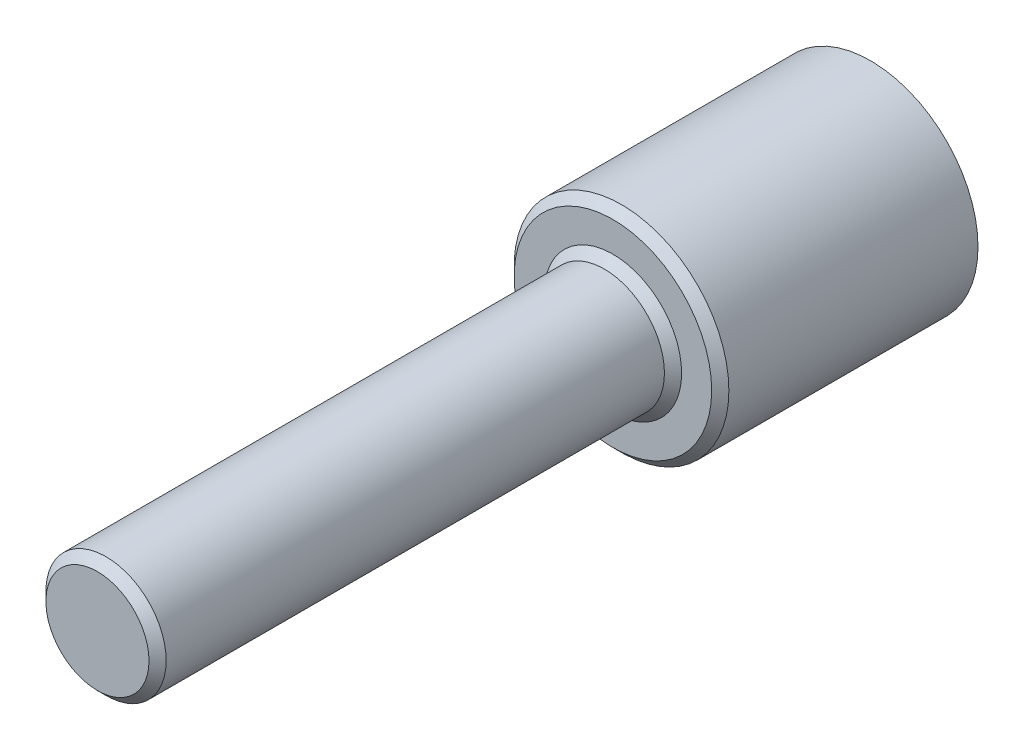
ISO-10303-21;
HEADER;
FILE_DESCRIPTION(('STEP AP214'),'2;1');
FILE_NAME('part.step','',(''),(''),'','','');
FILE_SCHEMA(('AUTOMOTIVE_DESIGN { 1 0 10303 214 1 1 1 1 }'));
ENDSEC;
DATA;
#1=APPLICATION_CONTEXT('core data for automotive mechanical design processes');
#2=APPLICATION_PROTOCOL_DEFINITION('international standard','automotive_design',2000,#1);
#3=PRODUCT_CONTEXT('',#1,'mechanical');
#4=PRODUCT('Part','Part','',(#3));
#5=PRODUCT_RELATED_PRODUCT_CATEGORY('part','',(#4));
#6=PRODUCT_DEFINITION_FORMATION('','',#4);
#7=PRODUCT_DEFINITION_CONTEXT('part definition',#1,'design');
#8=PRODUCT_DEFINITION('design','',#6,#7);
#9=PRODUCT_DEFINITION_SHAPE('','',#8);
#10=(LENGTH_UNIT() NAMED_UNIT(*) SI_UNIT(.MILLI.,.METRE.));
#11=(NAMED_UNIT(*) PLANE_ANGLE_UNIT() SI_UNIT($,.RADIAN.));
#12=(NAMED_UNIT(*) SI_UNIT($,.STERADIAN.) SOLID_ANGLE_UNIT());
#13=UNCERTAINTY_MEASURE_WITH_UNIT(LENGTH_MEASURE(1.E-05),#10,'distance_accuracy_value','');
#14=(GEOMETRIC_REPRESENTATION_CONTEXT(3) GLOBAL_UNCERTAINTY_ASSIGNED_CONTEXT((#13)) GLOBAL_UNIT_ASSIGNED_CONTEXT((#10,
#11,#12)) REPRESENTATION_CONTEXT('',''));
#15=CARTESIAN_POINT('',(0.,0.,0.));
#16=DIRECTION('',(0.,0.,1.));
#17=DIRECTION('',(1.,0.,0.));
#18=AXIS2_PLACEMENT_3D('',#15,#16,#17);
#19=CARTESIAN_POINT('',(0.,0.,28.575));
#20=DIRECTION('',(0.,0.,-1.));
#21=DIRECTION('',(-1.,0.,0.));
#22=AXIS2_PLACEMENT_3D('',#19,#20,#21);
#23=CYLINDRICAL_SURFACE('',#22,3.96875);
#24=CARTESIAN_POINT('',(0.,0.,9.20749999999999));
#25=DIRECTION('',(0.,0.,1.));
#26=DIRECTION('',(1.,0.,0.));
#27=AXIS2_PLACEMENT_3D('',#24,#25,#26);
#28=CIRCLE('',#27,3.96875);
#29=CARTESIAN_POINT('',(3.96875,0.,9.20749999999999));
#30=VERTEX_POINT('',#29);
#31=EDGE_CURVE('E10',#30,#30,#28,.F.);
#32=ORIENTED_EDGE('',*,*,#31,.T.);
#33=EDGE_LOOP('',(#32));
#34=FACE_BOUND('',#33,.T.);
#35=CARTESIAN_POINT('',(0.,0.,0.));
#36=DIRECTION('',(0.,0.,1.));
#37=DIRECTION('',(1.,0.,0.));
#38=AXIS2_PLACEMENT_3D('',#35,#36,#37);
#39=CIRCLE('',#38,3.96875);
#40=CARTESIAN_POINT('',(3.96875,0.,0.));
#41=VERTEX_POINT('',#40);
#42=EDGE_CURVE('E68',#41,#41,#39,.T.);
#43=ORIENTED_EDGE('',*,*,#42,.T.);
#44=EDGE_LOOP('',(#43));
#45=FACE_BOUND('',#44,.T.);
#46=ADVANCED_FACE('F35',(#34,#45),#23,.T.);
#47=CARTESIAN_POINT('',(0.,0.,0.));
#48=DIRECTION('',(0.,0.,1.));
#49=DIRECTION('',(1.,0.,0.));
#50=AXIS2_PLACEMENT_3D('',#47,#48,#49);
#51=PLANE('',#50);
#52=CARTESIAN_POINT('',(0.,0.,0.));
#53=DIRECTION('',(0.,0.,-1.));
#54=DIRECTION('',(-1.,0.,0.));
#55=AXIS2_PLACEMENT_3D('',#52,#53,#54);
#56=CIRCLE('',#55,2.4892);
#57=CARTESIAN_POINT('',(-2.4892,0.,0.));
#58=VERTEX_POINT('',#57);
#59=EDGE_CURVE('E73',#58,#58,#56,.T.);
#60=ORIENTED_EDGE('',*,*,#59,.F.);
#61=EDGE_LOOP('',(#60));
#62=FACE_BOUND('',#61,.T.);
#63=ORIENTED_EDGE('',*,*,#42,.F.);
#64=EDGE_LOOP('',(#63));
#65=FACE_BOUND('',#64,.T.);
#66=ADVANCED_FACE('F89',(#62,#65),#51,.F.);
#67=CARTESIAN_POINT('',(0.,0.,9.525));
#68=DIRECTION('',(0.,0.,1.));
#69=DIRECTION('',(1.,0.,0.));
#70=AXIS2_PLACEMENT_3D('',#67,#68,#69);
#71=CYLINDRICAL_SURFACE('',#70,2.2225);
#72=CARTESIAN_POINT('',(0.,0.,28.2575));
#73=DIRECTION('',(0.,0.,1.));
#74=DIRECTION('',(1.,0.,0.));
#75=AXIS2_PLACEMENT_3D('',#72,#73,#74);
#76=CIRCLE('',#75,2.2225);
#77=CARTESIAN_POINT('',(2.2225,0.,28.2575));
#78=VERTEX_POINT('',#77);
#79=EDGE_CURVE('E55',#78,#78,#76,.F.);
#80=CARTESIAN_POINT('',(0.,0.,9.84250000000001));
#81=DIRECTION('',(0.,0.,1.));
#82=DIRECTION('',(1.,0.,0.));
#83=AXIS2_PLACEMENT_3D('',#80,#81,#82);
#84=CIRCLE('',#83,2.2225);
#85=CARTESIAN_POINT('',(2.2225,0.,9.84250000000001));
#86=VERTEX_POINT('',#85);
#87=EDGE_CURVE('E61',#86,#86,#84,.T.);
#88=CARTESIAN_POINT('',(2.2225,0.,28.2575));
#89=CARTESIAN_POINT('',(2.2225,0.,28.0656770833333));
#90=CARTESIAN_POINT('',(2.2225,0.,27.8738541666667));
#91=CARTESIAN_POINT('',(2.2225,0.,27.4902083333333));
#92=CARTESIAN_POINT('',(2.2225,0.,27.2983854166667));
#93=CARTESIAN_POINT('',(2.2225,0.,26.9147395833333));
#94=CARTESIAN_POINT('',(2.2225,0.,26.7229166666667));
#95=CARTESIAN_POINT('',(2.2225,0.,26.3392708333333));
#96=CARTESIAN_POINT('',(2.2225,0.,26.1474479166667));
#97=CARTESIAN_POINT('',(2.2225,0.,25.7638020833333));
#98=CARTESIAN_POINT('',(2.2225,0.,25.5719791666667));
#99=CARTESIAN_POINT('',(2.2225,0.,25.1883333333333));
#100=CARTESIAN_POINT('',(2.2225,0.,24.9965104166667));
#101=CARTESIAN_POINT('',(2.2225,0.,24.6128645833333));
#102=CARTESIAN_POINT('',(2.2225,0.,24.4210416666667));
#103=CARTESIAN_POINT('',(2.2225,0.,24.0373958333333));
#104=CARTESIAN_POINT('',(2.2225,0.,23.8455729166667));
#105=CARTESIAN_POINT('',(2.2225,0.,23.4619270833333));
#106=CARTESIAN_POINT('',(2.2225,0.,23.2701041666667));
#107=CARTESIAN_POINT('',(2.2225,0.,22.8864583333333));
#108=CARTESIAN_POINT('',(2.2225,0.,22.6946354166667));
#109=CARTESIAN_POINT('',(2.2225,0.,22.3109895833333));
#110=CARTESIAN_POINT('',(2.2225,0.,22.1191666666667));
#111=CARTESIAN_POINT('',(2.2225,0.,21.7355208333333));
#112=CARTESIAN_POINT('',(2.2225,0.,21.5436979166667));
#113=CARTESIAN_POINT('',(2.2225,0.,21.1600520833333));
#114=CARTESIAN_POINT('',(2.2225,0.,20.9682291666667));
#115=CARTESIAN_POINT('',(2.2225,0.,20.5845833333333));
#116=CARTESIAN_POINT('',(2.2225,0.,20.3927604166667));
#117=CARTESIAN_POINT('',(2.2225,0.,20.0091145833333));
#118=CARTESIAN_POINT('',(2.2225,0.,19.8172916666667));
#119=CARTESIAN_POINT('',(2.2225,0.,19.4336458333333));
#120=CARTESIAN_POINT('',(2.2225,0.,19.2418229166667));
#121=CARTESIAN_POINT('',(2.2225,0.,18.8581770833333));
#122=CARTESIAN_POINT('',(2.2225,0.,18.6663541666667));
#123=CARTESIAN_POINT('',(2.2225,0.,18.2827083333333));
#124=CARTESIAN_POINT('',(2.2225,0.,18.0908854166667));
#125=CARTESIAN_POINT('',(2.2225,0.,17.7072395833333));
#126=CARTESIAN_POINT('',(2.2225,0.,17.5154166666667));
#127=CARTESIAN_POINT('',(2.2225,0.,17.1317708333333));
#128=CARTESIAN_POINT('',(2.2225,0.,16.9399479166667));
#129=CARTESIAN_POINT('',(2.2225,0.,16.5563020833333));
#130=CARTESIAN_POINT('',(2.2225,0.,16.3644791666667));
#131=CARTESIAN_POINT('',(2.2225,0.,15.9808333333333));
#132=CARTESIAN_POINT('',(2.2225,0.,15.7890104166667));
#133=CARTESIAN_POINT('',(2.2225,0.,15.4053645833333));
#134=CARTESIAN_POINT('',(2.2225,0.,15.2135416666667));
#135=CARTESIAN_POINT('',(2.2225,0.,14.8298958333333));
#136=CARTESIAN_POINT('',(2.2225,0.,14.6380729166667));
#137=CARTESIAN_POINT('',(2.2225,0.,14.2544270833333));
#138=CARTESIAN_POINT('',(2.2225,0.,14.0626041666667));
#139=CARTESIAN_POINT('',(2.2225,0.,13.6789583333333));
#140=CARTESIAN_POINT('',(2.2225,0.,13.4871354166667));
#141=CARTESIAN_POINT('',(2.2225,0.,13.1034895833333));
#142=CARTESIAN_POINT('',(2.2225,0.,12.9116666666667));
#143=CARTESIAN_POINT('',(2.2225,0.,12.5280208333333));
#144=CARTESIAN_POINT('',(2.2225,0.,12.3361979166667));
#145=CARTESIAN_POINT('',(2.2225,0.,11.9525520833333));
#146=CARTESIAN_POINT('',(2.2225,0.,11.7607291666667));
#147=CARTESIAN_POINT('',(2.2225,0.,11.3770833333333));
#148=CARTESIAN_POINT('',(2.2225,0.,11.1852604166667));
#149=CARTESIAN_POINT('',(2.2225,0.,10.8016145833333));
#150=CARTESIAN_POINT('',(2.2225,0.,10.6097916666667));
#151=CARTESIAN_POINT('',(2.2225,0.,10.2261458333333));
#152=CARTESIAN_POINT('',(2.2225,0.,10.0343229166667));
#153=CARTESIAN_POINT('',(2.2225,0.,9.84250000000001));
#154=B_SPLINE_CURVE_WITH_KNOTS('',3,(#88,#89,#90,#91,#92,#93,#94,#95,#96,#97,#98,#99,#100,#101,
#102,#103,#104,#105,#106,#107,#108,#109,#110,#111,#112,#113,#114,#115,#116,#117,#118,#119,#120,
#121,#122,#123,#124,#125,#126,#127,#128,#129,#130,#131,#132,#133,#134,#135,#136,#137,#138,#139,
#140,#141,#142,#143,#144,#145,#146,#147,#148,#149,#150,#151,#152,#153),.UNSPECIFIED.,.F.,.F.,(4,
2,2,2,2,2,2,2,2,2,2,2,2,2,2,2,2,2,2,2,2,2,2,2,2,2,2,2,2,2,2,2,4),(0.,0.575468749999999,
1.1509375,1.72640625,2.301875,2.87734375,3.4528125,4.02828125,4.60375,5.17921875,5.7546875,
6.33015625,6.905625,7.48109375,8.0565625,8.63203125,9.2075,9.78296875,10.3584375,10.93390625,
11.509375,12.08484375,12.6603125,13.23578125,13.81125,14.38671875,14.9621875,15.53765625,
16.113125,16.68859375,17.2640625,17.83953125,18.415),.UNSPECIFIED.);
#155=EDGE_CURVE('BSEAM92',#78,#86,#154,.T.);
#156=ORIENTED_EDGE('',*,*,#79,.T.);
#157=ORIENTED_EDGE('',*,*,#87,.T.);
#158=ORIENTED_EDGE('',*,*,#155,.T.);
#159=ORIENTED_EDGE('',*,*,#155,.F.);
#160=EDGE_LOOP('',(#156,#158,#157,#159));
#161=FACE_BOUND('',#160,.T.);
#162=ADVANCED_FACE('F92',(#161),#71,.T.);
#163=CARTESIAN_POINT('',(0.,0.,9.525));
#164=DIRECTION('',(0.,0.,1.));
#165=DIRECTION('',(1.,0.,0.));
#166=AXIS2_PLACEMENT_3D('',#163,#164,#165);
#167=PLANE('',#166);
#168=CARTESIAN_POINT('',(0.,0.,9.525));
#169=DIRECTION('',(0.,0.,1.));
#170=DIRECTION('',(1.,0.,0.));
#171=AXIS2_PLACEMENT_3D('',#168,#169,#170);
#172=CIRCLE('',#171,3.65124999999999);
#173=CARTESIAN_POINT('',(3.65124999999999,0.,9.525));
#174=VERTEX_POINT('',#173);
#175=EDGE_CURVE('E43',#174,#174,#172,.T.);
#176=ORIENTED_EDGE('',*,*,#175,.T.);
#177=EDGE_LOOP('',(#176));
#178=FACE_BOUND('',#177,.T.);
#179=CARTESIAN_POINT('',(0.,0.,9.525));
#180=DIRECTION('',(0.,0.,1.));
#181=DIRECTION('',(1.,0.,0.));
#182=AXIS2_PLACEMENT_3D('',#179,#180,#181);
#183=CIRCLE('',#182,2.54);
#184=CARTESIAN_POINT('',(2.54,0.,9.525));
#185=VERTEX_POINT('',#184);
#186=EDGE_CURVE('E49',#185,#185,#183,.F.);
#187=ORIENTED_EDGE('',*,*,#186,.T.);
#188=EDGE_LOOP('',(#187));
#189=FACE_BOUND('',#188,.T.);
#190=ADVANCED_FACE('F120',(#178,#189),#167,.T.);
#191=CARTESIAN_POINT('',(0.,0.,28.575));
#192=DIRECTION('',(0.,0.,1.));
#193=DIRECTION('',(1.,0.,0.));
#194=AXIS2_PLACEMENT_3D('',#191,#192,#193);
#195=PLANE('',#194);
#196=CARTESIAN_POINT('',(0.,0.,28.575));
#197=DIRECTION('',(0.,0.,1.));
#198=DIRECTION('',(1.,0.,0.));
#199=AXIS2_PLACEMENT_3D('',#196,#197,#198);
#200=CIRCLE('',#199,1.90500000000001);
#201=CARTESIAN_POINT('',(1.90500000000001,0.,28.575));
#202=VERTEX_POINT('',#201);
#203=EDGE_CURVE('E64',#202,#202,#200,.T.);
#204=ORIENTED_EDGE('',*,*,#203,.T.);
#205=EDGE_LOOP('',(#204));
#206=FACE_BOUND('',#205,.T.);
#207=ADVANCED_FACE('F85',(#206),#195,.T.);
#208=CARTESIAN_POINT('',(0.,0.,7.62));
#209=DIRECTION('',(0.,0.,-1.));
#210=DIRECTION('',(-1.,0.,0.));
#211=AXIS2_PLACEMENT_3D('',#208,#209,#210);
#212=CYLINDRICAL_SURFACE('',#211,2.4892);
#213=CARTESIAN_POINT('',(0.,0.,7.62));
#214=DIRECTION('',(0.,0.,-1.));
#215=DIRECTION('',(-1.,0.,0.));
#216=AXIS2_PLACEMENT_3D('',#213,#214,#215);
#217=CIRCLE('',#216,2.4892);
#218=CARTESIAN_POINT('',(-2.4892,0.,7.62));
#219=VERTEX_POINT('',#218);
#220=EDGE_CURVE('E72',#219,#219,#217,.T.);
#221=CARTESIAN_POINT('',(-2.4892,0.,7.62));
#222=CARTESIAN_POINT('',(-2.4892,0.,7.540625));
#223=CARTESIAN_POINT('',(-2.4892,0.,7.46125));
#224=CARTESIAN_POINT('',(-2.4892,0.,7.3025));
#225=CARTESIAN_POINT('',(-2.4892,0.,7.223125));
#226=CARTESIAN_POINT('',(-2.4892,0.,7.064375));
#227=CARTESIAN_POINT('',(-2.4892,0.,6.985));
#228=CARTESIAN_POINT('',(-2.4892,0.,6.82625));
#229=CARTESIAN_POINT('',(-2.4892,0.,6.746875));
#230=CARTESIAN_POINT('',(-2.4892,0.,6.588125));
#231=CARTESIAN_POINT('',(-2.4892,0.,6.50875));
#232=CARTESIAN_POINT('',(-2.4892,0.,6.35));
#233=CARTESIAN_POINT('',(-2.4892,0.,6.270625));
#234=CARTESIAN_POINT('',(-2.4892,0.,6.111875));
#235=CARTESIAN_POINT('',(-2.4892,0.,6.0325));
#236=CARTESIAN_POINT('',(-2.4892,0.,5.87375));
#237=CARTESIAN_POINT('',(-2.4892,0.,5.794375));
#238=CARTESIAN_POINT('',(-2.4892,0.,5.635625));
#239=CARTESIAN_POINT('',(-2.4892,0.,5.55625));
#240=CARTESIAN_POINT('',(-2.4892,0.,5.3975));
#241=CARTESIAN_POINT('',(-2.4892,0.,5.318125));
#242=CARTESIAN_POINT('',(-2.4892,0.,5.159375));
#243=CARTESIAN_POINT('',(-2.4892,0.,5.08));
#244=CARTESIAN_POINT('',(-2.4892,0.,4.92125));
#245=CARTESIAN_POINT('',(-2.4892,0.,4.841875));
#246=CARTESIAN_POINT('',(-2.4892,0.,4.683125));
#247=CARTESIAN_POINT('',(-2.4892,0.,4.60375));
#248=CARTESIAN_POINT('',(-2.4892,0.,4.445));
#249=CARTESIAN_POINT('',(-2.4892,0.,4.365625));
#250=CARTESIAN_POINT('',(-2.4892,0.,4.206875));
#251=CARTESIAN_POINT('',(-2.4892,0.,4.1275));
#252=CARTESIAN_POINT('',(-2.4892,0.,3.96875));
#253=CARTESIAN_POINT('',(-2.4892,0.,3.889375));
#254=CARTESIAN_POINT('',(-2.4892,0.,3.730625));
#255=CARTESIAN_POINT('',(-2.4892,0.,3.65125));
#256=CARTESIAN_POINT('',(-2.4892,0.,3.4925));
#257=CARTESIAN_POINT('',(-2.4892,0.,3.413125));
#258=CARTESIAN_POINT('',(-2.4892,0.,3.254375));
#259=CARTESIAN_POINT('',(-2.4892,0.,3.175));
#260=CARTESIAN_POINT('',(-2.4892,0.,3.01625));
#261=CARTESIAN_POINT('',(-2.4892,0.,2.936875));
#262=CARTESIAN_POINT('',(-2.4892,0.,2.778125));
#263=CARTESIAN_POINT('',(-2.4892,0.,2.69875));
#264=CARTESIAN_POINT('',(-2.4892,0.,2.54));
#265=CARTESIAN_POINT('',(-2.4892,0.,2.460625));
#266=CARTESIAN_POINT('',(-2.4892,0.,2.301875));
#267=CARTESIAN_POINT('',(-2.4892,0.,2.2225));
#268=CARTESIAN_POINT('',(-2.4892,0.,2.06375));
#269=CARTESIAN_POINT('',(-2.4892,0.,1.984375));
#270=CARTESIAN_POINT('',(-2.4892,0.,1.825625));
#271=CARTESIAN_POINT('',(-2.4892,0.,1.74625));
#272=CARTESIAN_POINT('',(-2.4892,0.,1.5875));
#273=CARTESIAN_POINT('',(-2.4892,0.,1.508125));
#274=CARTESIAN_POINT('',(-2.4892,0.,1.349375));
#275=CARTESIAN_POINT('',(-2.4892,0.,1.27));
#276=CARTESIAN_POINT('',(-2.4892,0.,1.11125));
#277=CARTESIAN_POINT('',(-2.4892,0.,1.031875));
#278=CARTESIAN_POINT('',(-2.4892,0.,0.873125));
#279=CARTESIAN_POINT('',(-2.4892,0.,0.79375));
#280=CARTESIAN_POINT('',(-2.4892,0.,0.635));
#281=CARTESIAN_POINT('',(-2.4892,0.,0.555625));
#282=CARTESIAN_POINT('',(-2.4892,0.,0.396875));
#283=CARTESIAN_POINT('',(-2.4892,0.,0.3175));
#284=CARTESIAN_POINT('',(-2.4892,0.,0.15875));
#285=CARTESIAN_POINT('',(-2.4892,0.,0.0793749999999999));
#286=CARTESIAN_POINT('',(-2.4892,0.,0.));
#287=B_SPLINE_CURVE_WITH_KNOTS('',3,(#221,#222,#223,#224,#225,#226,#227,#228,#229,#230,#231,
#232,#233,#234,#235,#236,#237,#238,#239,#240,#241,#242,#243,#244,#245,#246,#247,#248,#249,#250,
#251,#252,#253,#254,#255,#256,#257,#258,#259,#260,#261,#262,#263,#264,#265,#266,#267,#268,#269,
#270,#271,#272,#273,#274,#275,#276,#277,#278,#279,#280,#281,#282,#283,#284,#285,#286),
.UNSPECIFIED.,.F.,.F.,(4,2,2,2,2,2,2,2,2,2,2,2,2,2,2,2,2,2,2,2,2,2,2,2,2,2,2,2,2,2,2,2,4),(0.,
0.238125,0.476249999999999,0.714375,0.952499999999999,1.190625,1.42875,1.666875,1.905,2.143125,
2.38125,2.619375,2.8575,3.095625,3.33375,3.571875,3.81,4.048125,4.28625,4.524375,4.7625,
5.000625,5.23875,5.476875,5.715,5.953125,6.19125,6.429375,6.6675,6.905625,7.14375,7.381875,
7.62),.UNSPECIFIED.);
#288=EDGE_CURVE('BSEAM82',#219,#58,#287,.T.);
#289=ORIENTED_EDGE('',*,*,#220,.F.);
#290=ORIENTED_EDGE('',*,*,#59,.T.);
#291=ORIENTED_EDGE('',*,*,#288,.T.);
#292=ORIENTED_EDGE('',*,*,#288,.F.);
#293=EDGE_LOOP('',(#289,#291,#290,#292));
#294=FACE_BOUND('',#293,.T.);
#295=ADVANCED_FACE('F82',(#294),#212,.F.);
#296=CARTESIAN_POINT('',(0.,0.,7.62));
#297=DIRECTION('',(0.,0.,-1.));
#298=DIRECTION('',(-1.,0.,0.));
#299=AXIS2_PLACEMENT_3D('',#296,#297,#298);
#300=PLANE('',#299);
#301=ORIENTED_EDGE('',*,*,#220,.T.);
#302=EDGE_LOOP('',(#301));
#303=FACE_BOUND('',#302,.T.);
#304=ADVANCED_FACE('F80',(#303),#300,.T.);
#305=CARTESIAN_POINT('',(0.,0.,28.575));
#306=DIRECTION('',(0.,0.,-1.));
#307=DIRECTION('',(-1.,0.,0.));
#308=AXIS2_PLACEMENT_3D('',#305,#306,#307);
#309=CONICAL_SURFACE('',#308,1.90500000000001,0.78539816339745);
#310=ORIENTED_EDGE('',*,*,#79,.F.);
#311=EDGE_LOOP('',(#310));
#312=FACE_BOUND('',#311,.T.);
#313=ORIENTED_EDGE('',*,*,#203,.F.);
#314=EDGE_LOOP('',(#313));
#315=FACE_BOUND('',#314,.T.);
#316=ADVANCED_FACE('F102',(#312,#315),#309,.T.);
#317=CARTESIAN_POINT('',(0.,0.,9.525));
#318=DIRECTION('',(0.,0.,-1.));
#319=DIRECTION('',(-1.,0.,0.));
#320=AXIS2_PLACEMENT_3D('',#317,#318,#319);
#321=CONICAL_SURFACE('',#320,3.65124999999999,0.785398163397443);
#322=ORIENTED_EDGE('',*,*,#31,.F.);
#323=EDGE_LOOP('',(#322));
#324=FACE_BOUND('',#323,.T.);
#325=ORIENTED_EDGE('',*,*,#175,.F.);
#326=EDGE_LOOP('',(#325));
#327=FACE_BOUND('',#326,.T.);
#328=ADVANCED_FACE('F104',(#324,#327),#321,.T.);
#329=CARTESIAN_POINT('',(0.,0.,9.84250000000001));
#330=DIRECTION('',(0.,0.,-1.));
#331=DIRECTION('',(-1.,0.,0.));
#332=AXIS2_PLACEMENT_3D('',#329,#330,#331);
#333=CONICAL_SURFACE('',#332,2.2225,0.785398163397438);
#334=ORIENTED_EDGE('',*,*,#186,.F.);
#335=EDGE_LOOP('',(#334));
#336=FACE_BOUND('',#335,.T.);
#337=ORIENTED_EDGE('',*,*,#87,.F.);
#338=EDGE_LOOP('',(#337));
#339=FACE_BOUND('',#338,.T.);
#340=ADVANCED_FACE('F37',(#336,#339),#333,.T.);
#341=CLOSED_SHELL('',(#46,#66,#162,#190,#207,#295,#304,#316,#328,#340));
#342=MANIFOLD_SOLID_BREP('B2',#341);
#343=ADVANCED_BREP_SHAPE_REPRESENTATION('',(#18,#342),#14);
#344=SHAPE_DEFINITION_REPRESENTATION(#9,#343);
ENDSEC;
END-ISO-10303-21;
